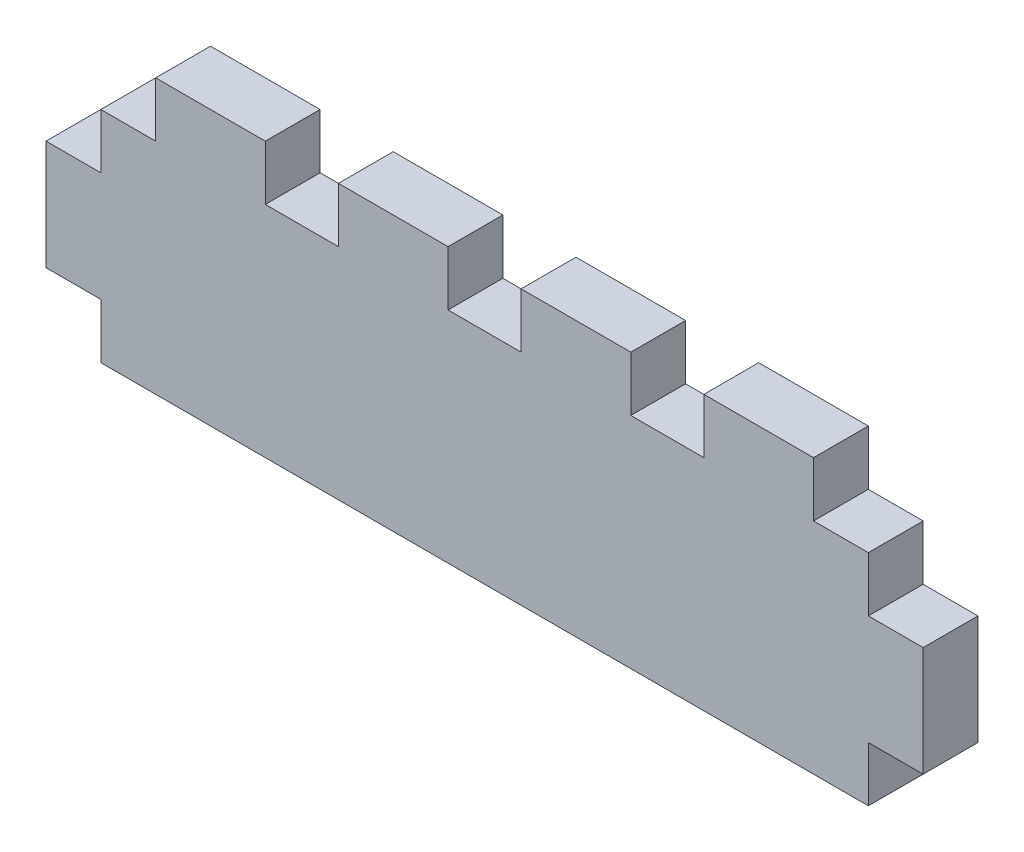
ISO-10303-21;
HEADER;
FILE_DESCRIPTION(('STEP AP214'),'2;1');
FILE_NAME('part.step','',(''),(''),'','','');
FILE_SCHEMA(('AUTOMOTIVE_DESIGN { 1 0 10303 214 1 1 1 1 }'));
ENDSEC;
DATA;
#1=APPLICATION_CONTEXT('core data for automotive mechanical design processes');
#2=APPLICATION_PROTOCOL_DEFINITION('international standard','automotive_design',2000,#1);
#3=PRODUCT_CONTEXT('',#1,'mechanical');
#4=PRODUCT('Part','Part','',(#3));
#5=PRODUCT_RELATED_PRODUCT_CATEGORY('part','',(#4));
#6=PRODUCT_DEFINITION_FORMATION('','',#4);
#7=PRODUCT_DEFINITION_CONTEXT('part definition',#1,'design');
#8=PRODUCT_DEFINITION('design','',#6,#7);
#9=PRODUCT_DEFINITION_SHAPE('','',#8);
#10=(LENGTH_UNIT() NAMED_UNIT(*) SI_UNIT(.MILLI.,.METRE.));
#11=(NAMED_UNIT(*) PLANE_ANGLE_UNIT() SI_UNIT($,.RADIAN.));
#12=(NAMED_UNIT(*) SI_UNIT($,.STERADIAN.) SOLID_ANGLE_UNIT());
#13=UNCERTAINTY_MEASURE_WITH_UNIT(LENGTH_MEASURE(1.E-05),#10,'distance_accuracy_value','');
#14=(GEOMETRIC_REPRESENTATION_CONTEXT(3) GLOBAL_UNCERTAINTY_ASSIGNED_CONTEXT((#13)) GLOBAL_UNIT_ASSIGNED_CONTEXT((#10,
#11,#12)) REPRESENTATION_CONTEXT('',''));
#15=CARTESIAN_POINT('',(0.,0.,0.));
#16=DIRECTION('',(0.,0.,1.));
#17=DIRECTION('',(1.,0.,0.));
#18=AXIS2_PLACEMENT_3D('',#15,#16,#17);
#19=CARTESIAN_POINT('',(0.,0.,12.7));
#20=DIRECTION('',(-1.,0.,0.));
#21=DIRECTION('',(0.,0.,1.));
#22=AXIS2_PLACEMENT_3D('',#19,#20,#21);
#23=PLANE('',#22);
#24=DIRECTION('',(0.,0.,1.));
#25=VECTOR('',#24,1.);
#26=CARTESIAN_POINT('',(0.,38.1,0.));
#27=LINE('',#26,#25);
#28=CARTESIAN_POINT('',(0.,38.1,0.));
#29=VERTEX_POINT('',#28);
#30=CARTESIAN_POINT('',(0.,38.1,12.7));
#31=VERTEX_POINT('',#30);
#32=EDGE_CURVE('E223',#29,#31,#27,.T.);
#33=ORIENTED_EDGE('',*,*,#32,.F.);
#34=DIRECTION('',(0.,1.,0.));
#35=VECTOR('',#34,1.);
#36=CARTESIAN_POINT('',(0.,0.,0.));
#37=LINE('',#36,#35);
#38=CARTESIAN_POINT('',(0.,50.8,0.));
#39=VERTEX_POINT('',#38);
#40=EDGE_CURVE('E236',#29,#39,#37,.T.);
#41=ORIENTED_EDGE('',*,*,#40,.T.);
#42=DIRECTION('',(0.,0.,-1.));
#43=VECTOR('',#42,1.);
#44=CARTESIAN_POINT('',(0.,50.8,12.7));
#45=LINE('',#44,#43);
#46=CARTESIAN_POINT('',(0.,50.8,12.7));
#47=VERTEX_POINT('',#46);
#48=EDGE_CURVE('E11',#47,#39,#45,.T.);
#49=ORIENTED_EDGE('',*,*,#48,.F.);
#50=DIRECTION('',(0.,1.,0.));
#51=VECTOR('',#50,1.);
#52=CARTESIAN_POINT('',(0.,0.,12.7));
#53=LINE('',#52,#51);
#54=EDGE_CURVE('E238',#31,#47,#53,.T.);
#55=ORIENTED_EDGE('',*,*,#54,.F.);
#56=EDGE_LOOP('',(#33,#41,#49,#55));
#57=FACE_BOUND('',#56,.T.);
#58=ADVANCED_FACE('F33',(#57),#23,.F.);
#59=CARTESIAN_POINT('',(-177.8,0.,12.7));
#60=DIRECTION('',(1.,0.,0.));
#61=DIRECTION('',(0.,0.,-1.));
#62=AXIS2_PLACEMENT_3D('',#59,#60,#61);
#63=PLANE('',#62);
#64=DIRECTION('',(0.,0.,1.));
#65=VECTOR('',#64,1.);
#66=CARTESIAN_POINT('',(-177.8,12.7,0.));
#67=LINE('',#66,#65);
#68=CARTESIAN_POINT('',(-177.8,12.7,0.));
#69=VERTEX_POINT('',#68);
#70=CARTESIAN_POINT('',(-177.8,12.7,12.7));
#71=VERTEX_POINT('',#70);
#72=EDGE_CURVE('E332',#69,#71,#67,.T.);
#73=ORIENTED_EDGE('',*,*,#72,.F.);
#74=DIRECTION('',(0.,-1.,0.));
#75=VECTOR('',#74,1.);
#76=CARTESIAN_POINT('',(-177.8,0.,0.));
#77=LINE('',#76,#75);
#78=CARTESIAN_POINT('',(-177.8,0.,0.));
#79=VERTEX_POINT('',#78);
#80=EDGE_CURVE('E319',#69,#79,#77,.T.);
#81=ORIENTED_EDGE('',*,*,#80,.T.);
#82=DIRECTION('',(0.,0.,-1.));
#83=VECTOR('',#82,1.);
#84=CARTESIAN_POINT('',(-177.8,0.,12.7));
#85=LINE('',#84,#83);
#86=CARTESIAN_POINT('',(-177.8,0.,12.7));
#87=VERTEX_POINT('',#86);
#88=EDGE_CURVE('E429',#87,#79,#85,.T.);
#89=ORIENTED_EDGE('',*,*,#88,.F.);
#90=DIRECTION('',(0.,-1.,0.));
#91=VECTOR('',#90,1.);
#92=CARTESIAN_POINT('',(-177.8,0.,12.7));
#93=LINE('',#92,#91);
#94=EDGE_CURVE('E304',#71,#87,#93,.T.);
#95=ORIENTED_EDGE('',*,*,#94,.F.);
#96=EDGE_LOOP('',(#73,#81,#89,#95));
#97=FACE_BOUND('',#96,.T.);
#98=ADVANCED_FACE('F402',(#97),#63,.F.);
#99=CARTESIAN_POINT('',(0.,50.8,12.7));
#100=DIRECTION('',(0.,-1.,0.));
#101=DIRECTION('',(1.,0.,0.));
#102=AXIS2_PLACEMENT_3D('',#99,#100,#101);
#103=PLANE('',#102);
#104=DIRECTION('',(-1.,0.,0.));
#105=VECTOR('',#104,1.);
#106=CARTESIAN_POINT('',(0.,50.8,12.7));
#107=LINE('',#106,#105);
#108=CARTESIAN_POINT('',(-38.1,50.8,12.7));
#109=VERTEX_POINT('',#108);
#110=CARTESIAN_POINT('',(-55.0333333333333,50.8,12.7));
#111=VERTEX_POINT('',#110);
#112=EDGE_CURVE('E289',#109,#111,#107,.T.);
#113=ORIENTED_EDGE('',*,*,#112,.F.);
#114=DIRECTION('',(0.,0.,1.));
#115=VECTOR('',#114,1.);
#116=CARTESIAN_POINT('',(-38.1,50.8,0.));
#117=LINE('',#116,#115);
#118=CARTESIAN_POINT('',(-38.1,50.8,0.));
#119=VERTEX_POINT('',#118);
#120=EDGE_CURVE('E564',#119,#109,#117,.T.);
#121=ORIENTED_EDGE('',*,*,#120,.F.);
#122=DIRECTION('',(-1.,0.,0.));
#123=VECTOR('',#122,1.);
#124=CARTESIAN_POINT('',(0.,50.8,0.));
#125=LINE('',#124,#123);
#126=CARTESIAN_POINT('',(-55.0333333333333,50.8,0.));
#127=VERTEX_POINT('',#126);
#128=EDGE_CURVE('E285',#119,#127,#125,.T.);
#129=ORIENTED_EDGE('',*,*,#128,.T.);
#130=DIRECTION('',(0.,0.,1.));
#131=VECTOR('',#130,1.);
#132=CARTESIAN_POINT('',(-55.0333333333333,50.8,0.));
#133=LINE('',#132,#131);
#134=EDGE_CURVE('E552',#127,#111,#133,.T.);
#135=ORIENTED_EDGE('',*,*,#134,.T.);
#136=EDGE_LOOP('',(#113,#121,#129,#135));
#137=FACE_BOUND('',#136,.T.);
#138=ADVANCED_FACE('F406',(#137),#103,.F.);
#139=CARTESIAN_POINT('',(-80.4333333333333,50.8,12.7));
#140=VERTEX_POINT('',#139);
#141=CARTESIAN_POINT('',(-97.3666666666667,50.8,12.7));
#142=VERTEX_POINT('',#141);
#143=EDGE_CURVE('E288',#140,#142,#107,.T.);
#144=ORIENTED_EDGE('',*,*,#143,.F.);
#145=DIRECTION('',(0.,0.,1.));
#146=VECTOR('',#145,1.);
#147=CARTESIAN_POINT('',(-80.4333333333333,50.8,0.));
#148=LINE('',#147,#146);
#149=CARTESIAN_POINT('',(-80.4333333333333,50.8,0.));
#150=VERTEX_POINT('',#149);
#151=EDGE_CURVE('E528',#150,#140,#148,.T.);
#152=ORIENTED_EDGE('',*,*,#151,.F.);
#153=CARTESIAN_POINT('',(-97.3666666666667,50.8,0.));
#154=VERTEX_POINT('',#153);
#155=EDGE_CURVE('E283',#150,#154,#125,.T.);
#156=ORIENTED_EDGE('',*,*,#155,.T.);
#157=DIRECTION('',(0.,0.,1.));
#158=VECTOR('',#157,1.);
#159=CARTESIAN_POINT('',(-97.3666666666667,50.8,0.));
#160=LINE('',#159,#158);
#161=EDGE_CURVE('E498',#154,#142,#160,.T.);
#162=ORIENTED_EDGE('',*,*,#161,.T.);
#163=EDGE_LOOP('',(#144,#152,#156,#162));
#164=FACE_BOUND('',#163,.T.);
#165=ADVANCED_FACE('F549',(#164),#103,.F.);
#166=CARTESIAN_POINT('',(-122.766666666667,50.8,12.7));
#167=VERTEX_POINT('',#166);
#168=CARTESIAN_POINT('',(-139.7,50.8,12.7));
#169=VERTEX_POINT('',#168);
#170=EDGE_CURVE('E286',#167,#169,#107,.T.);
#171=ORIENTED_EDGE('',*,*,#170,.F.);
#172=DIRECTION('',(0.,0.,1.));
#173=VECTOR('',#172,1.);
#174=CARTESIAN_POINT('',(-122.766666666667,50.8,0.));
#175=LINE('',#174,#173);
#176=CARTESIAN_POINT('',(-122.766666666667,50.8,0.));
#177=VERTEX_POINT('',#176);
#178=EDGE_CURVE('E506',#177,#167,#175,.T.);
#179=ORIENTED_EDGE('',*,*,#178,.F.);
#180=CARTESIAN_POINT('',(-139.7,50.8,0.));
#181=VERTEX_POINT('',#180);
#182=EDGE_CURVE('E279',#177,#181,#125,.T.);
#183=ORIENTED_EDGE('',*,*,#182,.T.);
#184=DIRECTION('',(0.,0.,1.));
#185=VECTOR('',#184,1.);
#186=CARTESIAN_POINT('',(-139.7,50.8,0.));
#187=LINE('',#186,#185);
#188=EDGE_CURVE('E467',#181,#169,#187,.T.);
#189=ORIENTED_EDGE('',*,*,#188,.T.);
#190=EDGE_LOOP('',(#171,#179,#183,#189));
#191=FACE_BOUND('',#190,.T.);
#192=ADVANCED_FACE('F418',(#191),#103,.F.);
#193=DIRECTION('',(0.,0.,1.));
#194=VECTOR('',#193,1.);
#195=CARTESIAN_POINT('',(-165.1,50.8,0.));
#196=LINE('',#195,#194);
#197=CARTESIAN_POINT('',(-165.1,50.8,0.));
#198=VERTEX_POINT('',#197);
#199=CARTESIAN_POINT('',(-165.1,50.8,12.7));
#200=VERTEX_POINT('',#199);
#201=EDGE_CURVE('E471',#198,#200,#196,.T.);
#202=ORIENTED_EDGE('',*,*,#201,.F.);
#203=CARTESIAN_POINT('',(-177.8,50.8,0.));
#204=VERTEX_POINT('',#203);
#205=EDGE_CURVE('E250',#198,#204,#125,.T.);
#206=ORIENTED_EDGE('',*,*,#205,.T.);
#207=DIRECTION('',(0.,0.,-1.));
#208=VECTOR('',#207,1.);
#209=CARTESIAN_POINT('',(-177.8,50.8,12.7));
#210=LINE('',#209,#208);
#211=CARTESIAN_POINT('',(-177.8,50.8,12.7));
#212=VERTEX_POINT('',#211);
#213=EDGE_CURVE('E42',#212,#204,#210,.T.);
#214=ORIENTED_EDGE('',*,*,#213,.F.);
#215=EDGE_CURVE('E298',#200,#212,#107,.T.);
#216=ORIENTED_EDGE('',*,*,#215,.F.);
#217=EDGE_LOOP('',(#202,#206,#214,#216));
#218=FACE_BOUND('',#217,.T.);
#219=ADVANCED_FACE('F411',(#218),#103,.F.);
#220=CARTESIAN_POINT('',(0.,0.,0.));
#221=VERTEX_POINT('',#220);
#222=CARTESIAN_POINT('',(0.,12.7,0.));
#223=VERTEX_POINT('',#222);
#224=EDGE_CURVE('E246',#221,#223,#37,.T.);
#225=ORIENTED_EDGE('',*,*,#224,.T.);
#226=DIRECTION('',(0.,0.,1.));
#227=VECTOR('',#226,1.);
#228=CARTESIAN_POINT('',(0.,12.7,0.));
#229=LINE('',#228,#227);
#230=CARTESIAN_POINT('',(0.,12.7,12.7));
#231=VERTEX_POINT('',#230);
#232=EDGE_CURVE('E239',#223,#231,#229,.T.);
#233=ORIENTED_EDGE('',*,*,#232,.T.);
#234=CARTESIAN_POINT('',(0.,0.,12.7));
#235=VERTEX_POINT('',#234);
#236=EDGE_CURVE('E257',#235,#231,#53,.T.);
#237=ORIENTED_EDGE('',*,*,#236,.F.);
#238=DIRECTION('',(0.,0.,-1.));
#239=VECTOR('',#238,1.);
#240=CARTESIAN_POINT('',(0.,0.,12.7));
#241=LINE('',#240,#239);
#242=EDGE_CURVE('E422',#235,#221,#241,.T.);
#243=ORIENTED_EDGE('',*,*,#242,.T.);
#244=EDGE_LOOP('',(#225,#233,#237,#243));
#245=FACE_BOUND('',#244,.T.);
#246=ADVANCED_FACE('F35',(#245),#23,.F.);
#247=CARTESIAN_POINT('',(-12.7,50.8,0.));
#248=VERTEX_POINT('',#247);
#249=EDGE_CURVE('E245',#39,#248,#125,.T.);
#250=ORIENTED_EDGE('',*,*,#249,.T.);
#251=DIRECTION('',(0.,0.,1.));
#252=VECTOR('',#251,1.);
#253=CARTESIAN_POINT('',(-12.7,50.8,0.));
#254=LINE('',#253,#252);
#255=CARTESIAN_POINT('',(-12.7,50.8,12.7));
#256=VERTEX_POINT('',#255);
#257=EDGE_CURVE('E592',#248,#256,#254,.T.);
#258=ORIENTED_EDGE('',*,*,#257,.T.);
#259=EDGE_CURVE('E302',#47,#256,#107,.T.);
#260=ORIENTED_EDGE('',*,*,#259,.F.);
#261=ORIENTED_EDGE('',*,*,#48,.T.);
#262=EDGE_LOOP('',(#250,#258,#260,#261));
#263=FACE_BOUND('',#262,.T.);
#264=ADVANCED_FACE('F410',(#263),#103,.F.);
#265=CARTESIAN_POINT('',(-177.8,38.1,0.));
#266=VERTEX_POINT('',#265);
#267=EDGE_CURVE('E315',#204,#266,#77,.T.);
#268=ORIENTED_EDGE('',*,*,#267,.T.);
#269=DIRECTION('',(0.,0.,1.));
#270=VECTOR('',#269,1.);
#271=CARTESIAN_POINT('',(-177.8,38.1,0.));
#272=LINE('',#271,#270);
#273=CARTESIAN_POINT('',(-177.8,38.1,12.7));
#274=VERTEX_POINT('',#273);
#275=EDGE_CURVE('E328',#266,#274,#272,.T.);
#276=ORIENTED_EDGE('',*,*,#275,.T.);
#277=EDGE_CURVE('E309',#212,#274,#93,.T.);
#278=ORIENTED_EDGE('',*,*,#277,.F.);
#279=ORIENTED_EDGE('',*,*,#213,.T.);
#280=EDGE_LOOP('',(#268,#276,#278,#279));
#281=FACE_BOUND('',#280,.T.);
#282=ADVANCED_FACE('F397',(#281),#63,.F.);
#283=CARTESIAN_POINT('',(0.,0.,12.7));
#284=DIRECTION('',(0.,1.,0.));
#285=DIRECTION('',(-1.,0.,0.));
#286=AXIS2_PLACEMENT_3D('',#283,#284,#285);
#287=PLANE('',#286);
#288=DIRECTION('',(1.,0.,0.));
#289=VECTOR('',#288,1.);
#290=CARTESIAN_POINT('',(0.,0.,0.));
#291=LINE('',#290,#289);
#292=EDGE_CURVE('E318',#79,#221,#291,.T.);
#293=ORIENTED_EDGE('',*,*,#292,.T.);
#294=ORIENTED_EDGE('',*,*,#242,.F.);
#295=DIRECTION('',(1.,0.,0.));
#296=VECTOR('',#295,1.);
#297=CARTESIAN_POINT('',(0.,0.,12.7));
#298=LINE('',#297,#296);
#299=EDGE_CURVE('E263',#87,#235,#298,.T.);
#300=ORIENTED_EDGE('',*,*,#299,.F.);
#301=ORIENTED_EDGE('',*,*,#88,.T.);
#302=EDGE_LOOP('',(#293,#294,#300,#301));
#303=FACE_BOUND('',#302,.T.);
#304=ADVANCED_FACE('F389',(#303),#287,.F.);
#305=CARTESIAN_POINT('',(0.,50.8,12.7));
#306=DIRECTION('',(0.,0.,1.));
#307=DIRECTION('',(1.,0.,0.));
#308=AXIS2_PLACEMENT_3D('',#305,#306,#307);
#309=PLANE('',#308);
#310=ORIENTED_EDGE('',*,*,#236,.T.);
#311=DIRECTION('',(1.,0.,0.));
#312=VECTOR('',#311,1.);
#313=CARTESIAN_POINT('',(12.7,12.7,12.7));
#314=LINE('',#313,#312);
#315=CARTESIAN_POINT('',(12.7,12.7,12.7));
#316=VERTEX_POINT('',#315);
#317=EDGE_CURVE('E50',#231,#316,#314,.T.);
#318=ORIENTED_EDGE('',*,*,#317,.T.);
#319=DIRECTION('',(0.,1.,0.));
#320=VECTOR('',#319,1.);
#321=CARTESIAN_POINT('',(12.7,38.1,12.7));
#322=LINE('',#321,#320);
#323=CARTESIAN_POINT('',(12.7,38.1,12.7));
#324=VERTEX_POINT('',#323);
#325=EDGE_CURVE('E231',#316,#324,#322,.T.);
#326=ORIENTED_EDGE('',*,*,#325,.T.);
#327=DIRECTION('',(-1.,0.,0.));
#328=VECTOR('',#327,1.);
#329=CARTESIAN_POINT('',(12.7,38.1,12.7));
#330=LINE('',#329,#328);
#331=EDGE_CURVE('E371',#324,#31,#330,.T.);
#332=ORIENTED_EDGE('',*,*,#331,.T.);
#333=ORIENTED_EDGE('',*,*,#54,.T.);
#334=ORIENTED_EDGE('',*,*,#259,.T.);
#335=DIRECTION('',(0.,1.,0.));
#336=VECTOR('',#335,1.);
#337=CARTESIAN_POINT('',(-12.7,63.5,12.7));
#338=LINE('',#337,#336);
#339=CARTESIAN_POINT('',(-12.7,63.5,12.7));
#340=VERTEX_POINT('',#339);
#341=EDGE_CURVE('E600',#256,#340,#338,.T.);
#342=ORIENTED_EDGE('',*,*,#341,.T.);
#343=DIRECTION('',(-1.,0.,0.));
#344=VECTOR('',#343,1.);
#345=CARTESIAN_POINT('',(-38.1,63.5,12.7));
#346=LINE('',#345,#344);
#347=CARTESIAN_POINT('',(-38.1,63.5,12.7));
#348=VERTEX_POINT('',#347);
#349=EDGE_CURVE('E596',#340,#348,#346,.T.);
#350=ORIENTED_EDGE('',*,*,#349,.T.);
#351=DIRECTION('',(0.,-1.,0.));
#352=VECTOR('',#351,1.);
#353=CARTESIAN_POINT('',(-38.1,63.5,12.7));
#354=LINE('',#353,#352);
#355=EDGE_CURVE('E604',#348,#109,#354,.T.);
#356=ORIENTED_EDGE('',*,*,#355,.T.);
#357=ORIENTED_EDGE('',*,*,#112,.T.);
#358=DIRECTION('',(0.,1.,0.));
#359=VECTOR('',#358,1.);
#360=CARTESIAN_POINT('',(-55.0333333333333,63.5,12.7));
#361=LINE('',#360,#359);
#362=CARTESIAN_POINT('',(-55.0333333333333,63.5,12.7));
#363=VERTEX_POINT('',#362);
#364=EDGE_CURVE('E561',#111,#363,#361,.T.);
#365=ORIENTED_EDGE('',*,*,#364,.T.);
#366=DIRECTION('',(-1.,0.,0.));
#367=VECTOR('',#366,1.);
#368=CARTESIAN_POINT('',(-80.4333333333333,63.5,12.7));
#369=LINE('',#368,#367);
#370=CARTESIAN_POINT('',(-80.4333333333333,63.5,12.7));
#371=VERTEX_POINT('',#370);
#372=EDGE_CURVE('E556',#363,#371,#369,.T.);
#373=ORIENTED_EDGE('',*,*,#372,.T.);
#374=DIRECTION('',(0.,-1.,0.));
#375=VECTOR('',#374,1.);
#376=CARTESIAN_POINT('',(-80.4333333333333,63.5,12.7));
#377=LINE('',#376,#375);
#378=EDGE_CURVE('E568',#371,#140,#377,.T.);
#379=ORIENTED_EDGE('',*,*,#378,.T.);
#380=ORIENTED_EDGE('',*,*,#143,.T.);
#381=DIRECTION('',(0.,1.,0.));
#382=VECTOR('',#381,1.);
#383=CARTESIAN_POINT('',(-97.3666666666667,63.5,12.7));
#384=LINE('',#383,#382);
#385=CARTESIAN_POINT('',(-97.3666666666667,63.5,12.7));
#386=VERTEX_POINT('',#385);
#387=EDGE_CURVE('E526',#142,#386,#384,.T.);
#388=ORIENTED_EDGE('',*,*,#387,.T.);
#389=DIRECTION('',(-1.,0.,0.));
#390=VECTOR('',#389,1.);
#391=CARTESIAN_POINT('',(-122.766666666667,63.5,12.7));
#392=LINE('',#391,#390);
#393=CARTESIAN_POINT('',(-122.766666666667,63.5,12.7));
#394=VERTEX_POINT('',#393);
#395=EDGE_CURVE('E501',#386,#394,#392,.T.);
#396=ORIENTED_EDGE('',*,*,#395,.T.);
#397=DIRECTION('',(0.,-1.,0.));
#398=VECTOR('',#397,1.);
#399=CARTESIAN_POINT('',(-122.766666666667,63.5,12.7));
#400=LINE('',#399,#398);
#401=EDGE_CURVE('E458',#394,#167,#400,.T.);
#402=ORIENTED_EDGE('',*,*,#401,.T.);
#403=ORIENTED_EDGE('',*,*,#170,.T.);
#404=DIRECTION('',(0.,1.,0.));
#405=VECTOR('',#404,1.);
#406=CARTESIAN_POINT('',(-139.7,50.8,12.7));
#407=LINE('',#406,#405);
#408=CARTESIAN_POINT('',(-139.7,63.5,12.7));
#409=VERTEX_POINT('',#408);
#410=EDGE_CURVE('E454',#169,#409,#407,.T.);
#411=ORIENTED_EDGE('',*,*,#410,.T.);
#412=DIRECTION('',(-1.,0.,0.));
#413=VECTOR('',#412,1.);
#414=CARTESIAN_POINT('',(-165.1,63.5,12.7));
#415=LINE('',#414,#413);
#416=CARTESIAN_POINT('',(-165.1,63.5,12.7));
#417=VERTEX_POINT('',#416);
#418=EDGE_CURVE('E469',#409,#417,#415,.T.);
#419=ORIENTED_EDGE('',*,*,#418,.T.);
#420=DIRECTION('',(0.,-1.,0.));
#421=VECTOR('',#420,1.);
#422=CARTESIAN_POINT('',(-165.1,50.8,12.7));
#423=LINE('',#422,#421);
#424=EDGE_CURVE('E470',#417,#200,#423,.T.);
#425=ORIENTED_EDGE('',*,*,#424,.T.);
#426=ORIENTED_EDGE('',*,*,#215,.T.);
#427=ORIENTED_EDGE('',*,*,#277,.T.);
#428=DIRECTION('',(-1.,0.,0.));
#429=VECTOR('',#428,1.);
#430=CARTESIAN_POINT('',(-190.5,38.1,12.7));
#431=LINE('',#430,#429);
#432=CARTESIAN_POINT('',(-190.5,38.1,12.7));
#433=VERTEX_POINT('',#432);
#434=EDGE_CURVE('E58',#274,#433,#431,.T.);
#435=ORIENTED_EDGE('',*,*,#434,.T.);
#436=DIRECTION('',(0.,-1.,0.));
#437=VECTOR('',#436,1.);
#438=CARTESIAN_POINT('',(-190.5,38.1,12.7));
#439=LINE('',#438,#437);
#440=CARTESIAN_POINT('',(-190.5,12.7,12.7));
#441=VERTEX_POINT('',#440);
#442=EDGE_CURVE('E351',#433,#441,#439,.T.);
#443=ORIENTED_EDGE('',*,*,#442,.T.);
#444=DIRECTION('',(1.,0.,0.));
#445=VECTOR('',#444,1.);
#446=CARTESIAN_POINT('',(-190.5,12.7,12.7));
#447=LINE('',#446,#445);
#448=EDGE_CURVE('E325',#441,#71,#447,.T.);
#449=ORIENTED_EDGE('',*,*,#448,.T.);
#450=ORIENTED_EDGE('',*,*,#94,.T.);
#451=ORIENTED_EDGE('',*,*,#299,.T.);
#452=EDGE_LOOP('',(#310,#318,#326,#332,#333,#334,#342,#350,#356,#357,#365,#373,#379,#380,#388,
#396,#402,#403,#411,#419,#425,#426,#427,#435,#443,#449,#450,#451));
#453=FACE_BOUND('',#452,.T.);
#454=ADVANCED_FACE('F386',(#453),#309,.T.);
#455=CARTESIAN_POINT('',(0.,50.8,0.));
#456=DIRECTION('',(0.,0.,1.));
#457=DIRECTION('',(1.,0.,0.));
#458=AXIS2_PLACEMENT_3D('',#455,#456,#457);
#459=PLANE('',#458);
#460=ORIENTED_EDGE('',*,*,#224,.F.);
#461=ORIENTED_EDGE('',*,*,#292,.F.);
#462=ORIENTED_EDGE('',*,*,#80,.F.);
#463=DIRECTION('',(1.,0.,0.));
#464=VECTOR('',#463,1.);
#465=CARTESIAN_POINT('',(-190.5,12.7,0.));
#466=LINE('',#465,#464);
#467=CARTESIAN_POINT('',(-190.5,12.7,0.));
#468=VERTEX_POINT('',#467);
#469=EDGE_CURVE('E346',#468,#69,#466,.T.);
#470=ORIENTED_EDGE('',*,*,#469,.F.);
#471=DIRECTION('',(0.,-1.,0.));
#472=VECTOR('',#471,1.);
#473=CARTESIAN_POINT('',(-190.5,38.1,0.));
#474=LINE('',#473,#472);
#475=CARTESIAN_POINT('',(-190.5,38.1,0.));
#476=VERTEX_POINT('',#475);
#477=EDGE_CURVE('E324',#476,#468,#474,.T.);
#478=ORIENTED_EDGE('',*,*,#477,.F.);
#479=DIRECTION('',(-1.,0.,0.));
#480=VECTOR('',#479,1.);
#481=CARTESIAN_POINT('',(-190.5,38.1,0.));
#482=LINE('',#481,#480);
#483=EDGE_CURVE('E333',#266,#476,#482,.T.);
#484=ORIENTED_EDGE('',*,*,#483,.F.);
#485=ORIENTED_EDGE('',*,*,#267,.F.);
#486=ORIENTED_EDGE('',*,*,#205,.F.);
#487=DIRECTION('',(0.,-1.,0.));
#488=VECTOR('',#487,1.);
#489=CARTESIAN_POINT('',(-165.1,50.8,0.));
#490=LINE('',#489,#488);
#491=CARTESIAN_POINT('',(-165.1,63.5,0.));
#492=VERTEX_POINT('',#491);
#493=EDGE_CURVE('E486',#492,#198,#490,.T.);
#494=ORIENTED_EDGE('',*,*,#493,.F.);
#495=DIRECTION('',(-1.,0.,0.));
#496=VECTOR('',#495,1.);
#497=CARTESIAN_POINT('',(-165.1,63.5,0.));
#498=LINE('',#497,#496);
#499=CARTESIAN_POINT('',(-139.7,63.5,0.));
#500=VERTEX_POINT('',#499);
#501=EDGE_CURVE('E474',#500,#492,#498,.T.);
#502=ORIENTED_EDGE('',*,*,#501,.F.);
#503=DIRECTION('',(0.,1.,0.));
#504=VECTOR('',#503,1.);
#505=CARTESIAN_POINT('',(-139.7,50.8,0.));
#506=LINE('',#505,#504);
#507=EDGE_CURVE('E480',#181,#500,#506,.T.);
#508=ORIENTED_EDGE('',*,*,#507,.F.);
#509=ORIENTED_EDGE('',*,*,#182,.F.);
#510=DIRECTION('',(0.,-1.,0.));
#511=VECTOR('',#510,1.);
#512=CARTESIAN_POINT('',(-122.766666666667,63.5,0.));
#513=LINE('',#512,#511);
#514=CARTESIAN_POINT('',(-122.766666666667,63.5,0.));
#515=VERTEX_POINT('',#514);
#516=EDGE_CURVE('E519',#515,#177,#513,.T.);
#517=ORIENTED_EDGE('',*,*,#516,.F.);
#518=DIRECTION('',(-1.,0.,0.));
#519=VECTOR('',#518,1.);
#520=CARTESIAN_POINT('',(-122.766666666667,63.5,0.));
#521=LINE('',#520,#519);
#522=CARTESIAN_POINT('',(-97.3666666666667,63.5,0.));
#523=VERTEX_POINT('',#522);
#524=EDGE_CURVE('E508',#523,#515,#521,.T.);
#525=ORIENTED_EDGE('',*,*,#524,.F.);
#526=DIRECTION('',(0.,1.,0.));
#527=VECTOR('',#526,1.);
#528=CARTESIAN_POINT('',(-97.3666666666667,63.5,0.));
#529=LINE('',#528,#527);
#530=EDGE_CURVE('E522',#154,#523,#529,.T.);
#531=ORIENTED_EDGE('',*,*,#530,.F.);
#532=ORIENTED_EDGE('',*,*,#155,.F.);
#533=DIRECTION('',(0.,-1.,0.));
#534=VECTOR('',#533,1.);
#535=CARTESIAN_POINT('',(-80.4333333333333,63.5,0.));
#536=LINE('',#535,#534);
#537=CARTESIAN_POINT('',(-80.4333333333333,63.5,0.));
#538=VERTEX_POINT('',#537);
#539=EDGE_CURVE('E545',#538,#150,#536,.T.);
#540=ORIENTED_EDGE('',*,*,#539,.F.);
#541=DIRECTION('',(-1.,0.,0.));
#542=VECTOR('',#541,1.);
#543=CARTESIAN_POINT('',(-80.4333333333333,63.5,0.));
#544=LINE('',#543,#542);
#545=CARTESIAN_POINT('',(-55.0333333333333,63.5,0.));
#546=VERTEX_POINT('',#545);
#547=EDGE_CURVE('E553',#546,#538,#544,.T.);
#548=ORIENTED_EDGE('',*,*,#547,.F.);
#549=DIRECTION('',(0.,1.,0.));
#550=VECTOR('',#549,1.);
#551=CARTESIAN_POINT('',(-55.0333333333333,63.5,0.));
#552=LINE('',#551,#550);
#553=EDGE_CURVE('E555',#127,#546,#552,.T.);
#554=ORIENTED_EDGE('',*,*,#553,.F.);
#555=ORIENTED_EDGE('',*,*,#128,.F.);
#556=DIRECTION('',(0.,-1.,0.));
#557=VECTOR('',#556,1.);
#558=CARTESIAN_POINT('',(-38.1,63.5,0.));
#559=LINE('',#558,#557);
#560=CARTESIAN_POINT('',(-38.1,63.5,0.));
#561=VERTEX_POINT('',#560);
#562=EDGE_CURVE('E588',#561,#119,#559,.T.);
#563=ORIENTED_EDGE('',*,*,#562,.F.);
#564=DIRECTION('',(-1.,0.,0.));
#565=VECTOR('',#564,1.);
#566=CARTESIAN_POINT('',(-38.1,63.5,0.));
#567=LINE('',#566,#565);
#568=CARTESIAN_POINT('',(-12.7,63.5,0.));
#569=VERTEX_POINT('',#568);
#570=EDGE_CURVE('E593',#569,#561,#567,.T.);
#571=ORIENTED_EDGE('',*,*,#570,.F.);
#572=DIRECTION('',(0.,1.,0.));
#573=VECTOR('',#572,1.);
#574=CARTESIAN_POINT('',(-12.7,63.5,0.));
#575=LINE('',#574,#573);
#576=EDGE_CURVE('E595',#248,#569,#575,.T.);
#577=ORIENTED_EDGE('',*,*,#576,.F.);
#578=ORIENTED_EDGE('',*,*,#249,.F.);
#579=ORIENTED_EDGE('',*,*,#40,.F.);
#580=DIRECTION('',(-1.,0.,0.));
#581=VECTOR('',#580,1.);
#582=CARTESIAN_POINT('',(12.7,38.1,0.));
#583=LINE('',#582,#581);
#584=CARTESIAN_POINT('',(12.7,38.1,0.));
#585=VERTEX_POINT('',#584);
#586=EDGE_CURVE('E219',#585,#29,#583,.T.);
#587=ORIENTED_EDGE('',*,*,#586,.F.);
#588=DIRECTION('',(0.,1.,0.));
#589=VECTOR('',#588,1.);
#590=CARTESIAN_POINT('',(12.7,38.1,0.));
#591=LINE('',#590,#589);
#592=CARTESIAN_POINT('',(12.7,12.7,0.));
#593=VERTEX_POINT('',#592);
#594=EDGE_CURVE('E240',#593,#585,#591,.T.);
#595=ORIENTED_EDGE('',*,*,#594,.F.);
#596=DIRECTION('',(1.,0.,0.));
#597=VECTOR('',#596,1.);
#598=CARTESIAN_POINT('',(12.7,12.7,0.));
#599=LINE('',#598,#597);
#600=EDGE_CURVE('E230',#223,#593,#599,.T.);
#601=ORIENTED_EDGE('',*,*,#600,.F.);
#602=EDGE_LOOP('',(#460,#461,#462,#470,#478,#484,#485,#486,#494,#502,#508,#509,#517,#525,#531,
#532,#540,#548,#554,#555,#563,#571,#577,#578,#579,#587,#595,#601));
#603=FACE_BOUND('',#602,.T.);
#604=ADVANCED_FACE('F243',(#603),#459,.F.);
#605=CARTESIAN_POINT('',(-165.1,50.8,0.));
#606=DIRECTION('',(-1.,0.,0.));
#607=DIRECTION('',(0.,-1.,0.));
#608=AXIS2_PLACEMENT_3D('',#605,#606,#607);
#609=PLANE('',#608);
#610=ORIENTED_EDGE('',*,*,#424,.F.);
#611=DIRECTION('',(0.,0.,1.));
#612=VECTOR('',#611,1.);
#613=CARTESIAN_POINT('',(-165.1,63.5,0.));
#614=LINE('',#613,#612);
#615=EDGE_CURVE('E247',#492,#417,#614,.T.);
#616=ORIENTED_EDGE('',*,*,#615,.F.);
#617=ORIENTED_EDGE('',*,*,#493,.T.);
#618=ORIENTED_EDGE('',*,*,#201,.T.);
#619=EDGE_LOOP('',(#610,#616,#617,#618));
#620=FACE_BOUND('',#619,.T.);
#621=ADVANCED_FACE('F395',(#620),#609,.T.);
#622=CARTESIAN_POINT('',(-165.1,63.5,0.));
#623=DIRECTION('',(0.,1.,0.));
#624=DIRECTION('',(0.,0.,1.));
#625=AXIS2_PLACEMENT_3D('',#622,#623,#624);
#626=PLANE('',#625);
#627=ORIENTED_EDGE('',*,*,#418,.F.);
#628=DIRECTION('',(0.,0.,1.));
#629=VECTOR('',#628,1.);
#630=CARTESIAN_POINT('',(-139.7,63.5,0.));
#631=LINE('',#630,#629);
#632=EDGE_CURVE('E252',#500,#409,#631,.T.);
#633=ORIENTED_EDGE('',*,*,#632,.F.);
#634=ORIENTED_EDGE('',*,*,#501,.T.);
#635=ORIENTED_EDGE('',*,*,#615,.T.);
#636=EDGE_LOOP('',(#627,#633,#634,#635));
#637=FACE_BOUND('',#636,.T.);
#638=ADVANCED_FACE('F512',(#637),#626,.T.);
#639=CARTESIAN_POINT('',(-139.7,50.8,0.));
#640=DIRECTION('',(1.,0.,0.));
#641=DIRECTION('',(0.,0.,-1.));
#642=AXIS2_PLACEMENT_3D('',#639,#640,#641);
#643=PLANE('',#642);
#644=ORIENTED_EDGE('',*,*,#410,.F.);
#645=ORIENTED_EDGE('',*,*,#188,.F.);
#646=ORIENTED_EDGE('',*,*,#507,.T.);
#647=ORIENTED_EDGE('',*,*,#632,.T.);
#648=EDGE_LOOP('',(#644,#645,#646,#647));
#649=FACE_BOUND('',#648,.T.);
#650=ADVANCED_FACE('F465',(#649),#643,.T.);
#651=CARTESIAN_POINT('',(-122.766666666667,63.5,0.));
#652=DIRECTION('',(-1.,0.,0.));
#653=DIRECTION('',(0.,0.,1.));
#654=AXIS2_PLACEMENT_3D('',#651,#652,#653);
#655=PLANE('',#654);
#656=ORIENTED_EDGE('',*,*,#401,.F.);
#657=DIRECTION('',(0.,0.,1.));
#658=VECTOR('',#657,1.);
#659=CARTESIAN_POINT('',(-122.766666666667,63.5,0.));
#660=LINE('',#659,#658);
#661=EDGE_CURVE('E490',#515,#394,#660,.T.);
#662=ORIENTED_EDGE('',*,*,#661,.F.);
#663=ORIENTED_EDGE('',*,*,#516,.T.);
#664=ORIENTED_EDGE('',*,*,#178,.T.);
#665=EDGE_LOOP('',(#656,#662,#663,#664));
#666=FACE_BOUND('',#665,.T.);
#667=ADVANCED_FACE('F521',(#666),#655,.T.);
#668=CARTESIAN_POINT('',(-122.766666666667,63.5,0.));
#669=DIRECTION('',(0.,1.,0.));
#670=DIRECTION('',(0.,0.,1.));
#671=AXIS2_PLACEMENT_3D('',#668,#669,#670);
#672=PLANE('',#671);
#673=ORIENTED_EDGE('',*,*,#395,.F.);
#674=DIRECTION('',(0.,0.,1.));
#675=VECTOR('',#674,1.);
#676=CARTESIAN_POINT('',(-97.3666666666667,63.5,0.));
#677=LINE('',#676,#675);
#678=EDGE_CURVE('E493',#523,#386,#677,.T.);
#679=ORIENTED_EDGE('',*,*,#678,.F.);
#680=ORIENTED_EDGE('',*,*,#524,.T.);
#681=ORIENTED_EDGE('',*,*,#661,.T.);
#682=EDGE_LOOP('',(#673,#679,#680,#681));
#683=FACE_BOUND('',#682,.T.);
#684=ADVANCED_FACE('F538',(#683),#672,.T.);
#685=CARTESIAN_POINT('',(-97.3666666666667,63.5,0.));
#686=DIRECTION('',(1.,0.,0.));
#687=DIRECTION('',(0.,0.,-1.));
#688=AXIS2_PLACEMENT_3D('',#685,#686,#687);
#689=PLANE('',#688);
#690=ORIENTED_EDGE('',*,*,#387,.F.);
#691=ORIENTED_EDGE('',*,*,#161,.F.);
#692=ORIENTED_EDGE('',*,*,#530,.T.);
#693=ORIENTED_EDGE('',*,*,#678,.T.);
#694=EDGE_LOOP('',(#690,#691,#692,#693));
#695=FACE_BOUND('',#694,.T.);
#696=ADVANCED_FACE('F540',(#695),#689,.T.);
#697=CARTESIAN_POINT('',(-80.4333333333333,63.5,0.));
#698=DIRECTION('',(-1.,0.,0.));
#699=DIRECTION('',(0.,0.,1.));
#700=AXIS2_PLACEMENT_3D('',#697,#698,#699);
#701=PLANE('',#700);
#702=ORIENTED_EDGE('',*,*,#378,.F.);
#703=DIRECTION('',(0.,0.,1.));
#704=VECTOR('',#703,1.);
#705=CARTESIAN_POINT('',(-80.4333333333333,63.5,0.));
#706=LINE('',#705,#704);
#707=EDGE_CURVE('E532',#538,#371,#706,.T.);
#708=ORIENTED_EDGE('',*,*,#707,.F.);
#709=ORIENTED_EDGE('',*,*,#539,.T.);
#710=ORIENTED_EDGE('',*,*,#151,.T.);
#711=EDGE_LOOP('',(#702,#708,#709,#710));
#712=FACE_BOUND('',#711,.T.);
#713=ADVANCED_FACE('F554',(#712),#701,.T.);
#714=CARTESIAN_POINT('',(-80.4333333333333,63.5,0.));
#715=DIRECTION('',(0.,1.,0.));
#716=DIRECTION('',(0.,0.,1.));
#717=AXIS2_PLACEMENT_3D('',#714,#715,#716);
#718=PLANE('',#717);
#719=ORIENTED_EDGE('',*,*,#372,.F.);
#720=DIRECTION('',(0.,0.,1.));
#721=VECTOR('',#720,1.);
#722=CARTESIAN_POINT('',(-55.0333333333333,63.5,0.));
#723=LINE('',#722,#721);
#724=EDGE_CURVE('E573',#546,#363,#723,.T.);
#725=ORIENTED_EDGE('',*,*,#724,.F.);
#726=ORIENTED_EDGE('',*,*,#547,.T.);
#727=ORIENTED_EDGE('',*,*,#707,.T.);
#728=EDGE_LOOP('',(#719,#725,#726,#727));
#729=FACE_BOUND('',#728,.T.);
#730=ADVANCED_FACE('F584',(#729),#718,.T.);
#731=CARTESIAN_POINT('',(-55.0333333333333,63.5,0.));
#732=DIRECTION('',(1.,0.,0.));
#733=DIRECTION('',(0.,0.,-1.));
#734=AXIS2_PLACEMENT_3D('',#731,#732,#733);
#735=PLANE('',#734);
#736=ORIENTED_EDGE('',*,*,#364,.F.);
#737=ORIENTED_EDGE('',*,*,#134,.F.);
#738=ORIENTED_EDGE('',*,*,#553,.T.);
#739=ORIENTED_EDGE('',*,*,#724,.T.);
#740=EDGE_LOOP('',(#736,#737,#738,#739));
#741=FACE_BOUND('',#740,.T.);
#742=ADVANCED_FACE('F581',(#741),#735,.T.);
#743=CARTESIAN_POINT('',(-38.1,63.5,0.));
#744=DIRECTION('',(-1.,0.,0.));
#745=DIRECTION('',(0.,0.,1.));
#746=AXIS2_PLACEMENT_3D('',#743,#744,#745);
#747=PLANE('',#746);
#748=ORIENTED_EDGE('',*,*,#355,.F.);
#749=DIRECTION('',(0.,0.,1.));
#750=VECTOR('',#749,1.);
#751=CARTESIAN_POINT('',(-38.1,63.5,0.));
#752=LINE('',#751,#750);
#753=EDGE_CURVE('E570',#561,#348,#752,.T.);
#754=ORIENTED_EDGE('',*,*,#753,.F.);
#755=ORIENTED_EDGE('',*,*,#562,.T.);
#756=ORIENTED_EDGE('',*,*,#120,.T.);
#757=EDGE_LOOP('',(#748,#754,#755,#756));
#758=FACE_BOUND('',#757,.T.);
#759=ADVANCED_FACE('F594',(#758),#747,.T.);
#760=CARTESIAN_POINT('',(-38.1,63.5,0.));
#761=DIRECTION('',(0.,1.,0.));
#762=DIRECTION('',(0.,0.,1.));
#763=AXIS2_PLACEMENT_3D('',#760,#761,#762);
#764=PLANE('',#763);
#765=ORIENTED_EDGE('',*,*,#349,.F.);
#766=DIRECTION('',(0.,0.,1.));
#767=VECTOR('',#766,1.);
#768=CARTESIAN_POINT('',(-12.7,63.5,0.));
#769=LINE('',#768,#767);
#770=EDGE_CURVE('E608',#569,#340,#769,.T.);
#771=ORIENTED_EDGE('',*,*,#770,.F.);
#772=ORIENTED_EDGE('',*,*,#570,.T.);
#773=ORIENTED_EDGE('',*,*,#753,.T.);
#774=EDGE_LOOP('',(#765,#771,#772,#773));
#775=FACE_BOUND('',#774,.T.);
#776=ADVANCED_FACE('F614',(#775),#764,.T.);
#777=CARTESIAN_POINT('',(-12.7,63.5,0.));
#778=DIRECTION('',(1.,0.,0.));
#779=DIRECTION('',(0.,1.,0.));
#780=AXIS2_PLACEMENT_3D('',#777,#778,#779);
#781=PLANE('',#780);
#782=ORIENTED_EDGE('',*,*,#341,.F.);
#783=ORIENTED_EDGE('',*,*,#257,.F.);
#784=ORIENTED_EDGE('',*,*,#576,.T.);
#785=ORIENTED_EDGE('',*,*,#770,.T.);
#786=EDGE_LOOP('',(#782,#783,#784,#785));
#787=FACE_BOUND('',#786,.T.);
#788=ADVANCED_FACE('F611',(#787),#781,.T.);
#789=CARTESIAN_POINT('',(-190.5,38.1,0.));
#790=DIRECTION('',(-1.,0.,0.));
#791=DIRECTION('',(0.,0.,1.));
#792=AXIS2_PLACEMENT_3D('',#789,#790,#791);
#793=PLANE('',#792);
#794=ORIENTED_EDGE('',*,*,#442,.F.);
#795=DIRECTION('',(0.,0.,1.));
#796=VECTOR('',#795,1.);
#797=CARTESIAN_POINT('',(-190.5,38.1,0.));
#798=LINE('',#797,#796);
#799=EDGE_CURVE('E331',#476,#433,#798,.T.);
#800=ORIENTED_EDGE('',*,*,#799,.F.);
#801=ORIENTED_EDGE('',*,*,#477,.T.);
#802=DIRECTION('',(0.,0.,1.));
#803=VECTOR('',#802,1.);
#804=CARTESIAN_POINT('',(-190.5,12.7,0.));
#805=LINE('',#804,#803);
#806=EDGE_CURVE('E341',#468,#441,#805,.T.);
#807=ORIENTED_EDGE('',*,*,#806,.T.);
#808=EDGE_LOOP('',(#794,#800,#801,#807));
#809=FACE_BOUND('',#808,.T.);
#810=ADVANCED_FACE('F443',(#809),#793,.T.);
#811=CARTESIAN_POINT('',(-190.5,38.1,0.));
#812=DIRECTION('',(0.,1.,0.));
#813=DIRECTION('',(0.,0.,1.));
#814=AXIS2_PLACEMENT_3D('',#811,#812,#813);
#815=PLANE('',#814);
#816=ORIENTED_EDGE('',*,*,#434,.F.);
#817=ORIENTED_EDGE('',*,*,#275,.F.);
#818=ORIENTED_EDGE('',*,*,#483,.T.);
#819=ORIENTED_EDGE('',*,*,#799,.T.);
#820=EDGE_LOOP('',(#816,#817,#818,#819));
#821=FACE_BOUND('',#820,.T.);
#822=ADVANCED_FACE('F701',(#821),#815,.T.);
#823=CARTESIAN_POINT('',(-190.5,12.7,0.));
#824=DIRECTION('',(0.,-1.,0.));
#825=DIRECTION('',(1.,0.,0.));
#826=AXIS2_PLACEMENT_3D('',#823,#824,#825);
#827=PLANE('',#826);
#828=ORIENTED_EDGE('',*,*,#448,.F.);
#829=ORIENTED_EDGE('',*,*,#806,.F.);
#830=ORIENTED_EDGE('',*,*,#469,.T.);
#831=ORIENTED_EDGE('',*,*,#72,.T.);
#832=EDGE_LOOP('',(#828,#829,#830,#831));
#833=FACE_BOUND('',#832,.T.);
#834=ADVANCED_FACE('F445',(#833),#827,.T.);
#835=CARTESIAN_POINT('',(12.7,38.1,0.));
#836=DIRECTION('',(0.,1.,0.));
#837=DIRECTION('',(0.,0.,1.));
#838=AXIS2_PLACEMENT_3D('',#835,#836,#837);
#839=PLANE('',#838);
#840=ORIENTED_EDGE('',*,*,#331,.F.);
#841=DIRECTION('',(0.,0.,1.));
#842=VECTOR('',#841,1.);
#843=CARTESIAN_POINT('',(12.7,38.1,0.));
#844=LINE('',#843,#842);
#845=EDGE_CURVE('E225',#585,#324,#844,.T.);
#846=ORIENTED_EDGE('',*,*,#845,.F.);
#847=ORIENTED_EDGE('',*,*,#586,.T.);
#848=ORIENTED_EDGE('',*,*,#32,.T.);
#849=EDGE_LOOP('',(#840,#846,#847,#848));
#850=FACE_BOUND('',#849,.T.);
#851=ADVANCED_FACE('F222',(#850),#839,.T.);
#852=CARTESIAN_POINT('',(12.7,38.1,0.));
#853=DIRECTION('',(1.,0.,0.));
#854=DIRECTION('',(0.,0.,-1.));
#855=AXIS2_PLACEMENT_3D('',#852,#853,#854);
#856=PLANE('',#855);
#857=ORIENTED_EDGE('',*,*,#325,.F.);
#858=DIRECTION('',(0.,0.,1.));
#859=VECTOR('',#858,1.);
#860=CARTESIAN_POINT('',(12.7,12.7,0.));
#861=LINE('',#860,#859);
#862=EDGE_CURVE('E357',#593,#316,#861,.T.);
#863=ORIENTED_EDGE('',*,*,#862,.F.);
#864=ORIENTED_EDGE('',*,*,#594,.T.);
#865=ORIENTED_EDGE('',*,*,#845,.T.);
#866=EDGE_LOOP('',(#857,#863,#864,#865));
#867=FACE_BOUND('',#866,.T.);
#868=ADVANCED_FACE('F385',(#867),#856,.T.);
#869=CARTESIAN_POINT('',(12.7,12.7,0.));
#870=DIRECTION('',(0.,-1.,0.));
#871=DIRECTION('',(1.,0.,0.));
#872=AXIS2_PLACEMENT_3D('',#869,#870,#871);
#873=PLANE('',#872);
#874=ORIENTED_EDGE('',*,*,#317,.F.);
#875=ORIENTED_EDGE('',*,*,#232,.F.);
#876=ORIENTED_EDGE('',*,*,#600,.T.);
#877=ORIENTED_EDGE('',*,*,#862,.T.);
#878=EDGE_LOOP('',(#874,#875,#876,#877));
#879=FACE_BOUND('',#878,.T.);
#880=ADVANCED_FACE('F384',(#879),#873,.T.);
#881=CLOSED_SHELL('',(#58,#98,#138,#165,#192,#219,#246,#264,#282,#304,#454,#604,#621,#638,#650,
#667,#684,#696,#713,#730,#742,#759,#776,#788,#810,#822,#834,#851,#868,#880));
#882=MANIFOLD_SOLID_BREP('B2',#881);
#883=ADVANCED_BREP_SHAPE_REPRESENTATION('',(#18,#882),#14);
#884=SHAPE_DEFINITION_REPRESENTATION(#9,#883);
ENDSEC;
END-ISO-10303-21;
